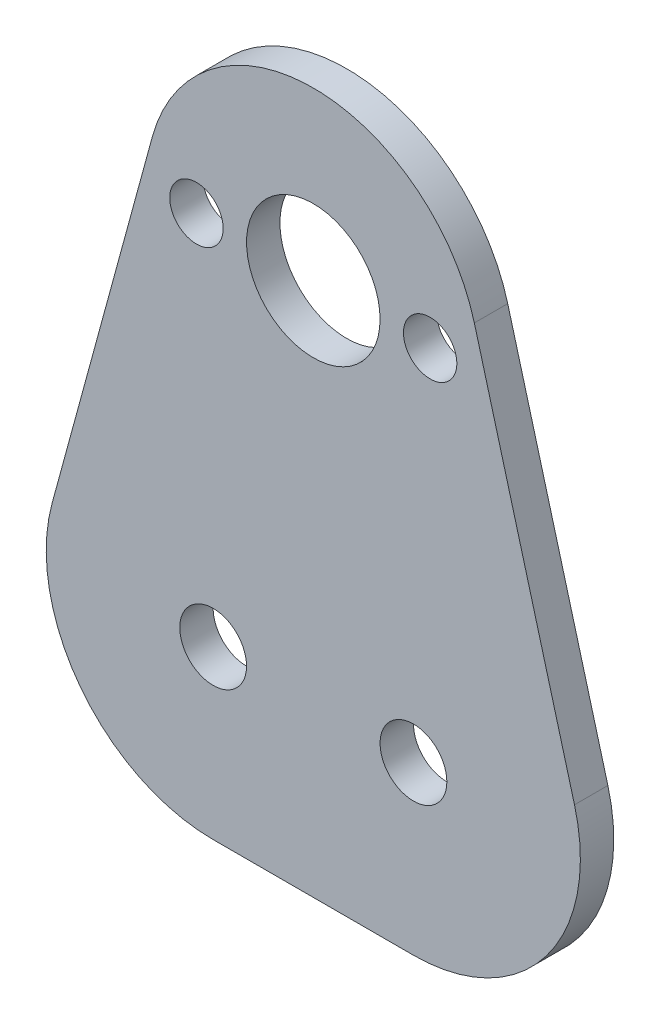
ISO-10303-21;
HEADER;
FILE_DESCRIPTION(('STEP AP214'),'2;1');
FILE_NAME('part.step','',(''),(''),'','','');
FILE_SCHEMA(('AUTOMOTIVE_DESIGN { 1 0 10303 214 1 1 1 1 }'));
ENDSEC;
DATA;
#1=APPLICATION_CONTEXT('core data for automotive mechanical design processes');
#2=APPLICATION_PROTOCOL_DEFINITION('international standard','automotive_design',2000,#1);
#3=PRODUCT_CONTEXT('',#1,'mechanical');
#4=PRODUCT('Part','Part','',(#3));
#5=PRODUCT_RELATED_PRODUCT_CATEGORY('part','',(#4));
#6=PRODUCT_DEFINITION_FORMATION('','',#4);
#7=PRODUCT_DEFINITION_CONTEXT('part definition',#1,'design');
#8=PRODUCT_DEFINITION('design','',#6,#7);
#9=PRODUCT_DEFINITION_SHAPE('','',#8);
#10=(LENGTH_UNIT() NAMED_UNIT(*) SI_UNIT(.MILLI.,.METRE.));
#11=(NAMED_UNIT(*) PLANE_ANGLE_UNIT() SI_UNIT($,.RADIAN.));
#12=(NAMED_UNIT(*) SI_UNIT($,.STERADIAN.) SOLID_ANGLE_UNIT());
#13=UNCERTAINTY_MEASURE_WITH_UNIT(LENGTH_MEASURE(1.E-05),#10,'distance_accuracy_value','');
#14=(GEOMETRIC_REPRESENTATION_CONTEXT(3) GLOBAL_UNCERTAINTY_ASSIGNED_CONTEXT((#13)) GLOBAL_UNIT_ASSIGNED_CONTEXT((#10,
#11,#12)) REPRESENTATION_CONTEXT('',''));
#15=CARTESIAN_POINT('',(0.,0.,0.));
#16=DIRECTION('',(0.,0.,1.));
#17=DIRECTION('',(1.,0.,0.));
#18=AXIS2_PLACEMENT_3D('',#15,#16,#17);
#19=CARTESIAN_POINT('',(-15.,-55.,2.5));
#20=DIRECTION('',(0.,0.,1.));
#21=DIRECTION('',(1.,0.,0.));
#22=AXIS2_PLACEMENT_3D('',#19,#20,#21);
#23=PLANE('',#22);
#24=CARTESIAN_POINT('',(17.5,0.,2.5));
#25=DIRECTION('',(0.,0.,1.));
#26=DIRECTION('',(1.,0.,0.));
#27=AXIS2_PLACEMENT_3D('',#24,#25,#26);
#28=CIRCLE('',#27,4.);
#29=CARTESIAN_POINT('',(21.5,0.,2.5));
#30=VERTEX_POINT('',#29);
#31=EDGE_CURVE('E193',#30,#30,#28,.T.);
#32=ORIENTED_EDGE('',*,*,#31,.F.);
#33=EDGE_LOOP('',(#32));
#34=FACE_BOUND('',#33,.T.);
#35=CARTESIAN_POINT('',(-17.5,0.,2.5));
#36=DIRECTION('',(0.,0.,1.));
#37=DIRECTION('',(1.,0.,0.));
#38=AXIS2_PLACEMENT_3D('',#35,#36,#37);
#39=CIRCLE('',#38,4.);
#40=CARTESIAN_POINT('',(-13.5,0.,2.5));
#41=VERTEX_POINT('',#40);
#42=EDGE_CURVE('E194',#41,#41,#39,.T.);
#43=ORIENTED_EDGE('',*,*,#42,.F.);
#44=EDGE_LOOP('',(#43));
#45=FACE_BOUND('',#44,.T.);
#46=CARTESIAN_POINT('',(-15.,-55.,2.5));
#47=DIRECTION('',(0.,0.,1.));
#48=DIRECTION('',(1.,0.,0.));
#49=AXIS2_PLACEMENT_3D('',#46,#47,#48);
#50=CIRCLE('',#49,5.);
#51=CARTESIAN_POINT('',(-9.99999999999999,-55.,2.5));
#52=VERTEX_POINT('',#51);
#53=EDGE_CURVE('E210',#52,#52,#50,.T.);
#54=ORIENTED_EDGE('',*,*,#53,.F.);
#55=EDGE_LOOP('',(#54));
#56=FACE_BOUND('',#55,.T.);
#57=CARTESIAN_POINT('',(-15.,-55.,2.5));
#58=DIRECTION('',(0.,0.,1.));
#59=DIRECTION('',(1.,0.,0.));
#60=AXIS2_PLACEMENT_3D('',#57,#58,#59);
#61=CIRCLE('',#60,25.);
#62=CARTESIAN_POINT('',(-39.1190955309433,-48.4220648551973,2.5));
#63=VERTEX_POINT('',#62);
#64=CARTESIAN_POINT('',(-15.,-80.,2.5));
#65=VERTEX_POINT('',#64);
#66=EDGE_CURVE('E135',#63,#65,#61,.T.);
#67=ORIENTED_EDGE('',*,*,#66,.T.);
#68=DIRECTION('',(1.,0.,0.));
#69=VECTOR('',#68,1.);
#70=CARTESIAN_POINT('',(-15.,-80.,2.5));
#71=LINE('',#70,#69);
#72=CARTESIAN_POINT('',(15.,-80.,2.5));
#73=VERTEX_POINT('',#72);
#74=EDGE_CURVE('E93',#65,#73,#71,.T.);
#75=ORIENTED_EDGE('',*,*,#74,.T.);
#76=CARTESIAN_POINT('',(15.,-55.,2.5));
#77=DIRECTION('',(0.,0.,1.));
#78=DIRECTION('',(1.,0.,0.));
#79=AXIS2_PLACEMENT_3D('',#76,#77,#78);
#80=CIRCLE('',#79,25.);
#81=CARTESIAN_POINT('',(39.1190955309433,-48.4220648551973,2.5));
#82=VERTEX_POINT('',#81);
#83=EDGE_CURVE('E106',#73,#82,#80,.T.);
#84=ORIENTED_EDGE('',*,*,#83,.T.);
#85=DIRECTION('',(-0.263117405792109,0.964763821237732,0.));
#86=VECTOR('',#85,1.);
#87=CARTESIAN_POINT('',(24.1190955309433,6.57793514480273,2.5));
#88=LINE('',#87,#86);
#89=CARTESIAN_POINT('',(24.1190955309433,6.57793514480273,2.5));
#90=VERTEX_POINT('',#89);
#91=EDGE_CURVE('E100',#82,#90,#88,.T.);
#92=ORIENTED_EDGE('',*,*,#91,.T.);
#93=CARTESIAN_POINT('',(0.,0.,2.5));
#94=DIRECTION('',(0.,0.,1.));
#95=DIRECTION('',(1.,0.,0.));
#96=AXIS2_PLACEMENT_3D('',#93,#94,#95);
#97=CIRCLE('',#96,25.);
#98=CARTESIAN_POINT('',(-24.1190955309433,6.57793514480272,2.5));
#99=VERTEX_POINT('',#98);
#100=EDGE_CURVE('E104',#90,#99,#97,.T.);
#101=ORIENTED_EDGE('',*,*,#100,.T.);
#102=DIRECTION('',(-0.263117405792109,-0.964763821237732,0.));
#103=VECTOR('',#102,1.);
#104=CARTESIAN_POINT('',(-39.1190955309433,-48.4220648551973,2.5));
#105=LINE('',#104,#103);
#106=EDGE_CURVE('E56',#99,#63,#105,.T.);
#107=ORIENTED_EDGE('',*,*,#106,.T.);
#108=EDGE_LOOP('',(#67,#75,#84,#92,#101,#107));
#109=FACE_BOUND('',#108,.T.);
#110=CARTESIAN_POINT('',(0.,0.,2.5));
#111=DIRECTION('',(0.,0.,1.));
#112=DIRECTION('',(1.,0.,0.));
#113=AXIS2_PLACEMENT_3D('',#110,#111,#112);
#114=CIRCLE('',#113,10.);
#115=CARTESIAN_POINT('',(10.,0.,2.5));
#116=VERTEX_POINT('',#115);
#117=EDGE_CURVE('E128',#116,#116,#114,.T.);
#118=ORIENTED_EDGE('',*,*,#117,.F.);
#119=EDGE_LOOP('',(#118));
#120=FACE_BOUND('',#119,.T.);
#121=CARTESIAN_POINT('',(15.,-55.,2.5));
#122=DIRECTION('',(0.,0.,1.));
#123=DIRECTION('',(1.,0.,0.));
#124=AXIS2_PLACEMENT_3D('',#121,#122,#123);
#125=CIRCLE('',#124,4.99999999999998);
#126=CARTESIAN_POINT('',(20.,-55.,2.5));
#127=VERTEX_POINT('',#126);
#128=EDGE_CURVE('E204',#127,#127,#125,.T.);
#129=ORIENTED_EDGE('',*,*,#128,.F.);
#130=EDGE_LOOP('',(#129));
#131=FACE_BOUND('',#130,.T.);
#132=ADVANCED_FACE('F39',(#34,#45,#56,#109,#120,#131),#23,.T.);
#133=CARTESIAN_POINT('',(-15.,-55.,-2.5));
#134=DIRECTION('',(0.,0.,1.));
#135=DIRECTION('',(1.,0.,0.));
#136=AXIS2_PLACEMENT_3D('',#133,#134,#135);
#137=PLANE('',#136);
#138=CARTESIAN_POINT('',(17.5,0.,-2.5));
#139=DIRECTION('',(0.,0.,1.));
#140=DIRECTION('',(1.,0.,0.));
#141=AXIS2_PLACEMENT_3D('',#138,#139,#140);
#142=CIRCLE('',#141,4.);
#143=CARTESIAN_POINT('',(21.5,0.,-2.5));
#144=VERTEX_POINT('',#143);
#145=EDGE_CURVE('E191',#144,#144,#142,.T.);
#146=ORIENTED_EDGE('',*,*,#145,.T.);
#147=EDGE_LOOP('',(#146));
#148=FACE_BOUND('',#147,.T.);
#149=CARTESIAN_POINT('',(-17.5,0.,-2.5));
#150=DIRECTION('',(0.,0.,1.));
#151=DIRECTION('',(1.,0.,0.));
#152=AXIS2_PLACEMENT_3D('',#149,#150,#151);
#153=CIRCLE('',#152,4.);
#154=CARTESIAN_POINT('',(-13.5,0.,-2.5));
#155=VERTEX_POINT('',#154);
#156=EDGE_CURVE('E199',#155,#155,#153,.T.);
#157=ORIENTED_EDGE('',*,*,#156,.T.);
#158=EDGE_LOOP('',(#157));
#159=FACE_BOUND('',#158,.T.);
#160=CARTESIAN_POINT('',(-15.,-55.,-2.5));
#161=DIRECTION('',(0.,0.,1.));
#162=DIRECTION('',(1.,0.,0.));
#163=AXIS2_PLACEMENT_3D('',#160,#161,#162);
#164=CIRCLE('',#163,25.);
#165=CARTESIAN_POINT('',(-39.1190955309433,-48.4220648551973,-2.5));
#166=VERTEX_POINT('',#165);
#167=CARTESIAN_POINT('',(-15.,-80.,-2.5));
#168=VERTEX_POINT('',#167);
#169=EDGE_CURVE('E124',#166,#168,#164,.T.);
#170=ORIENTED_EDGE('',*,*,#169,.F.);
#171=DIRECTION('',(-0.263117405792109,-0.964763821237732,0.));
#172=VECTOR('',#171,1.);
#173=CARTESIAN_POINT('',(-39.1190955309433,-48.4220648551973,-2.5));
#174=LINE('',#173,#172);
#175=CARTESIAN_POINT('',(-24.1190955309433,6.57793514480272,-2.5));
#176=VERTEX_POINT('',#175);
#177=EDGE_CURVE('E85',#176,#166,#174,.T.);
#178=ORIENTED_EDGE('',*,*,#177,.F.);
#179=CARTESIAN_POINT('',(0.,0.,-2.5));
#180=DIRECTION('',(0.,0.,1.));
#181=DIRECTION('',(1.,0.,0.));
#182=AXIS2_PLACEMENT_3D('',#179,#180,#181);
#183=CIRCLE('',#182,25.);
#184=CARTESIAN_POINT('',(24.1190955309433,6.57793514480273,-2.5));
#185=VERTEX_POINT('',#184);
#186=EDGE_CURVE('E79',#185,#176,#183,.T.);
#187=ORIENTED_EDGE('',*,*,#186,.F.);
#188=DIRECTION('',(-0.263117405792109,0.964763821237732,0.));
#189=VECTOR('',#188,1.);
#190=CARTESIAN_POINT('',(24.1190955309433,6.57793514480273,-2.5));
#191=LINE('',#190,#189);
#192=CARTESIAN_POINT('',(39.1190955309433,-48.4220648551973,-2.5));
#193=VERTEX_POINT('',#192);
#194=EDGE_CURVE('E114',#193,#185,#191,.T.);
#195=ORIENTED_EDGE('',*,*,#194,.F.);
#196=CARTESIAN_POINT('',(15.,-55.,-2.5));
#197=DIRECTION('',(0.,0.,1.));
#198=DIRECTION('',(1.,0.,0.));
#199=AXIS2_PLACEMENT_3D('',#196,#197,#198);
#200=CIRCLE('',#199,25.);
#201=CARTESIAN_POINT('',(15.,-80.,-2.5));
#202=VERTEX_POINT('',#201);
#203=EDGE_CURVE('E130',#202,#193,#200,.T.);
#204=ORIENTED_EDGE('',*,*,#203,.F.);
#205=DIRECTION('',(1.,0.,0.));
#206=VECTOR('',#205,1.);
#207=CARTESIAN_POINT('',(-15.,-80.,-2.5));
#208=LINE('',#207,#206);
#209=EDGE_CURVE('E127',#168,#202,#208,.T.);
#210=ORIENTED_EDGE('',*,*,#209,.F.);
#211=EDGE_LOOP('',(#170,#178,#187,#195,#204,#210));
#212=FACE_BOUND('',#211,.T.);
#213=CARTESIAN_POINT('',(0.,0.,-2.5));
#214=DIRECTION('',(0.,0.,1.));
#215=DIRECTION('',(1.,0.,0.));
#216=AXIS2_PLACEMENT_3D('',#213,#214,#215);
#217=CIRCLE('',#216,10.);
#218=CARTESIAN_POINT('',(10.,0.,-2.5));
#219=VERTEX_POINT('',#218);
#220=EDGE_CURVE('E213',#219,#219,#217,.T.);
#221=ORIENTED_EDGE('',*,*,#220,.T.);
#222=EDGE_LOOP('',(#221));
#223=FACE_BOUND('',#222,.T.);
#224=CARTESIAN_POINT('',(-15.,-55.,-2.5));
#225=DIRECTION('',(0.,0.,1.));
#226=DIRECTION('',(1.,0.,0.));
#227=AXIS2_PLACEMENT_3D('',#224,#225,#226);
#228=CIRCLE('',#227,5.);
#229=CARTESIAN_POINT('',(-9.99999999999999,-55.,-2.5));
#230=VERTEX_POINT('',#229);
#231=EDGE_CURVE('E207',#230,#230,#228,.T.);
#232=ORIENTED_EDGE('',*,*,#231,.T.);
#233=EDGE_LOOP('',(#232));
#234=FACE_BOUND('',#233,.T.);
#235=CARTESIAN_POINT('',(15.,-55.,-2.5));
#236=DIRECTION('',(0.,0.,1.));
#237=DIRECTION('',(1.,0.,0.));
#238=AXIS2_PLACEMENT_3D('',#235,#236,#237);
#239=CIRCLE('',#238,4.99999999999998);
#240=CARTESIAN_POINT('',(20.,-55.,-2.5));
#241=VERTEX_POINT('',#240);
#242=EDGE_CURVE('E196',#241,#241,#239,.T.);
#243=ORIENTED_EDGE('',*,*,#242,.T.);
#244=EDGE_LOOP('',(#243));
#245=FACE_BOUND('',#244,.T.);
#246=ADVANCED_FACE('F144',(#148,#159,#212,#223,#234,#245),#137,.F.);
#247=CARTESIAN_POINT('',(-15.,-55.,2.5));
#248=DIRECTION('',(0.,0.,-1.));
#249=DIRECTION('',(-1.,0.,0.));
#250=AXIS2_PLACEMENT_3D('',#247,#248,#249);
#251=CYLINDRICAL_SURFACE('',#250,25.);
#252=ORIENTED_EDGE('',*,*,#169,.T.);
#253=DIRECTION('',(0.,0.,-1.));
#254=VECTOR('',#253,1.);
#255=CARTESIAN_POINT('',(-15.,-80.,2.5));
#256=LINE('',#255,#254);
#257=EDGE_CURVE('E11',#65,#168,#256,.T.);
#258=ORIENTED_EDGE('',*,*,#257,.F.);
#259=ORIENTED_EDGE('',*,*,#66,.F.);
#260=DIRECTION('',(0.,0.,-1.));
#261=VECTOR('',#260,1.);
#262=CARTESIAN_POINT('',(-39.1190955309433,-48.4220648551973,2.5));
#263=LINE('',#262,#261);
#264=EDGE_CURVE('E120',#63,#166,#263,.T.);
#265=ORIENTED_EDGE('',*,*,#264,.T.);
#266=EDGE_LOOP('',(#252,#258,#259,#265));
#267=FACE_BOUND('',#266,.T.);
#268=ADVANCED_FACE('F41',(#267),#251,.T.);
#269=CARTESIAN_POINT('',(-15.,-80.,2.5));
#270=DIRECTION('',(0.,1.,0.));
#271=DIRECTION('',(0.,0.,1.));
#272=AXIS2_PLACEMENT_3D('',#269,#270,#271);
#273=PLANE('',#272);
#274=ORIENTED_EDGE('',*,*,#209,.T.);
#275=DIRECTION('',(0.,0.,-1.));
#276=VECTOR('',#275,1.);
#277=CARTESIAN_POINT('',(15.,-80.,2.5));
#278=LINE('',#277,#276);
#279=EDGE_CURVE('E48',#73,#202,#278,.T.);
#280=ORIENTED_EDGE('',*,*,#279,.F.);
#281=ORIENTED_EDGE('',*,*,#74,.F.);
#282=ORIENTED_EDGE('',*,*,#257,.T.);
#283=EDGE_LOOP('',(#274,#280,#281,#282));
#284=FACE_BOUND('',#283,.T.);
#285=ADVANCED_FACE('F262',(#284),#273,.F.);
#286=CARTESIAN_POINT('',(15.,-55.,2.5));
#287=DIRECTION('',(0.,0.,-1.));
#288=DIRECTION('',(-1.,0.,0.));
#289=AXIS2_PLACEMENT_3D('',#286,#287,#288);
#290=CYLINDRICAL_SURFACE('',#289,25.);
#291=ORIENTED_EDGE('',*,*,#203,.T.);
#292=DIRECTION('',(0.,0.,-1.));
#293=VECTOR('',#292,1.);
#294=CARTESIAN_POINT('',(39.1190955309433,-48.4220648551973,2.5));
#295=LINE('',#294,#293);
#296=EDGE_CURVE('E115',#82,#193,#295,.T.);
#297=ORIENTED_EDGE('',*,*,#296,.F.);
#298=ORIENTED_EDGE('',*,*,#83,.F.);
#299=ORIENTED_EDGE('',*,*,#279,.T.);
#300=EDGE_LOOP('',(#291,#297,#298,#299));
#301=FACE_BOUND('',#300,.T.);
#302=ADVANCED_FACE('F141',(#301),#290,.T.);
#303=CARTESIAN_POINT('',(24.1190955309433,6.57793514480273,2.5));
#304=DIRECTION('',(-0.964763821237732,-0.263117405792109,0.));
#305=DIRECTION('',(0.263117405792109,-0.964763821237732,0.));
#306=AXIS2_PLACEMENT_3D('',#303,#304,#305);
#307=PLANE('',#306);
#308=ORIENTED_EDGE('',*,*,#194,.T.);
#309=DIRECTION('',(0.,0.,-1.));
#310=VECTOR('',#309,1.);
#311=CARTESIAN_POINT('',(24.1190955309433,6.57793514480273,2.5));
#312=LINE('',#311,#310);
#313=EDGE_CURVE('E111',#90,#185,#312,.T.);
#314=ORIENTED_EDGE('',*,*,#313,.F.);
#315=ORIENTED_EDGE('',*,*,#91,.F.);
#316=ORIENTED_EDGE('',*,*,#296,.T.);
#317=EDGE_LOOP('',(#308,#314,#315,#316));
#318=FACE_BOUND('',#317,.T.);
#319=ADVANCED_FACE('F112',(#318),#307,.F.);
#320=CARTESIAN_POINT('',(0.,0.,2.5));
#321=DIRECTION('',(0.,0.,-1.));
#322=DIRECTION('',(-1.,0.,0.));
#323=AXIS2_PLACEMENT_3D('',#320,#321,#322);
#324=CYLINDRICAL_SURFACE('',#323,25.);
#325=ORIENTED_EDGE('',*,*,#186,.T.);
#326=DIRECTION('',(0.,0.,-1.));
#327=VECTOR('',#326,1.);
#328=CARTESIAN_POINT('',(-24.1190955309433,6.57793514480272,2.5));
#329=LINE('',#328,#327);
#330=EDGE_CURVE('E116',#99,#176,#329,.T.);
#331=ORIENTED_EDGE('',*,*,#330,.F.);
#332=ORIENTED_EDGE('',*,*,#100,.F.);
#333=ORIENTED_EDGE('',*,*,#313,.T.);
#334=EDGE_LOOP('',(#325,#331,#332,#333));
#335=FACE_BOUND('',#334,.T.);
#336=ADVANCED_FACE('F118',(#335),#324,.T.);
#337=CARTESIAN_POINT('',(-39.1190955309433,-48.4220648551973,2.5));
#338=DIRECTION('',(0.964763821237732,-0.263117405792109,0.));
#339=DIRECTION('',(0.263117405792109,0.964763821237732,0.));
#340=AXIS2_PLACEMENT_3D('',#337,#338,#339);
#341=PLANE('',#340);
#342=ORIENTED_EDGE('',*,*,#177,.T.);
#343=ORIENTED_EDGE('',*,*,#264,.F.);
#344=ORIENTED_EDGE('',*,*,#106,.F.);
#345=ORIENTED_EDGE('',*,*,#330,.T.);
#346=EDGE_LOOP('',(#342,#343,#344,#345));
#347=FACE_BOUND('',#346,.T.);
#348=ADVANCED_FACE('F149',(#347),#341,.F.);
#349=CARTESIAN_POINT('',(0.,0.,2.5));
#350=DIRECTION('',(0.,0.,-1.));
#351=DIRECTION('',(-1.,0.,0.));
#352=AXIS2_PLACEMENT_3D('',#349,#350,#351);
#353=CYLINDRICAL_SURFACE('',#352,10.);
#354=ORIENTED_EDGE('',*,*,#117,.T.);
#355=EDGE_LOOP('',(#354));
#356=FACE_BOUND('',#355,.T.);
#357=ORIENTED_EDGE('',*,*,#220,.F.);
#358=EDGE_LOOP('',(#357));
#359=FACE_BOUND('',#358,.T.);
#360=ADVANCED_FACE('F151',(#356,#359),#353,.F.);
#361=CARTESIAN_POINT('',(-15.,-55.,2.5));
#362=DIRECTION('',(0.,0.,-1.));
#363=DIRECTION('',(-1.,0.,0.));
#364=AXIS2_PLACEMENT_3D('',#361,#362,#363);
#365=CYLINDRICAL_SURFACE('',#364,5.);
#366=ORIENTED_EDGE('',*,*,#53,.T.);
#367=EDGE_LOOP('',(#366));
#368=FACE_BOUND('',#367,.T.);
#369=ORIENTED_EDGE('',*,*,#231,.F.);
#370=EDGE_LOOP('',(#369));
#371=FACE_BOUND('',#370,.T.);
#372=ADVANCED_FACE('F157',(#368,#371),#365,.F.);
#373=CARTESIAN_POINT('',(15.,-55.,2.5));
#374=DIRECTION('',(0.,0.,-1.));
#375=DIRECTION('',(-1.,0.,0.));
#376=AXIS2_PLACEMENT_3D('',#373,#374,#375);
#377=CYLINDRICAL_SURFACE('',#376,4.99999999999998);
#378=ORIENTED_EDGE('',*,*,#128,.T.);
#379=EDGE_LOOP('',(#378));
#380=FACE_BOUND('',#379,.T.);
#381=ORIENTED_EDGE('',*,*,#242,.F.);
#382=EDGE_LOOP('',(#381));
#383=FACE_BOUND('',#382,.T.);
#384=ADVANCED_FACE('F175',(#380,#383),#377,.F.);
#385=CARTESIAN_POINT('',(-17.5,0.,-2.5));
#386=DIRECTION('',(0.,0.,1.));
#387=DIRECTION('',(1.,0.,0.));
#388=AXIS2_PLACEMENT_3D('',#385,#386,#387);
#389=CYLINDRICAL_SURFACE('',#388,4.);
#390=ORIENTED_EDGE('',*,*,#156,.F.);
#391=EDGE_LOOP('',(#390));
#392=FACE_BOUND('',#391,.T.);
#393=ORIENTED_EDGE('',*,*,#42,.T.);
#394=EDGE_LOOP('',(#393));
#395=FACE_BOUND('',#394,.T.);
#396=ADVANCED_FACE('F178',(#392,#395),#389,.F.);
#397=CARTESIAN_POINT('',(17.5,0.,-2.5));
#398=DIRECTION('',(0.,0.,1.));
#399=DIRECTION('',(1.,0.,0.));
#400=AXIS2_PLACEMENT_3D('',#397,#398,#399);
#401=CYLINDRICAL_SURFACE('',#400,4.);
#402=ORIENTED_EDGE('',*,*,#145,.F.);
#403=EDGE_LOOP('',(#402));
#404=FACE_BOUND('',#403,.T.);
#405=ORIENTED_EDGE('',*,*,#31,.T.);
#406=EDGE_LOOP('',(#405));
#407=FACE_BOUND('',#406,.T.);
#408=ADVANCED_FACE('F182',(#404,#407),#401,.F.);
#409=CLOSED_SHELL('',(#132,#246,#268,#285,#302,#319,#336,#348,#360,#372,#384,#396,#408));
#410=MANIFOLD_SOLID_BREP('B2',#409);
#411=ADVANCED_BREP_SHAPE_REPRESENTATION('',(#18,#410),#14);
#412=SHAPE_DEFINITION_REPRESENTATION(#9,#411);
ENDSEC;
END-ISO-10303-21;
